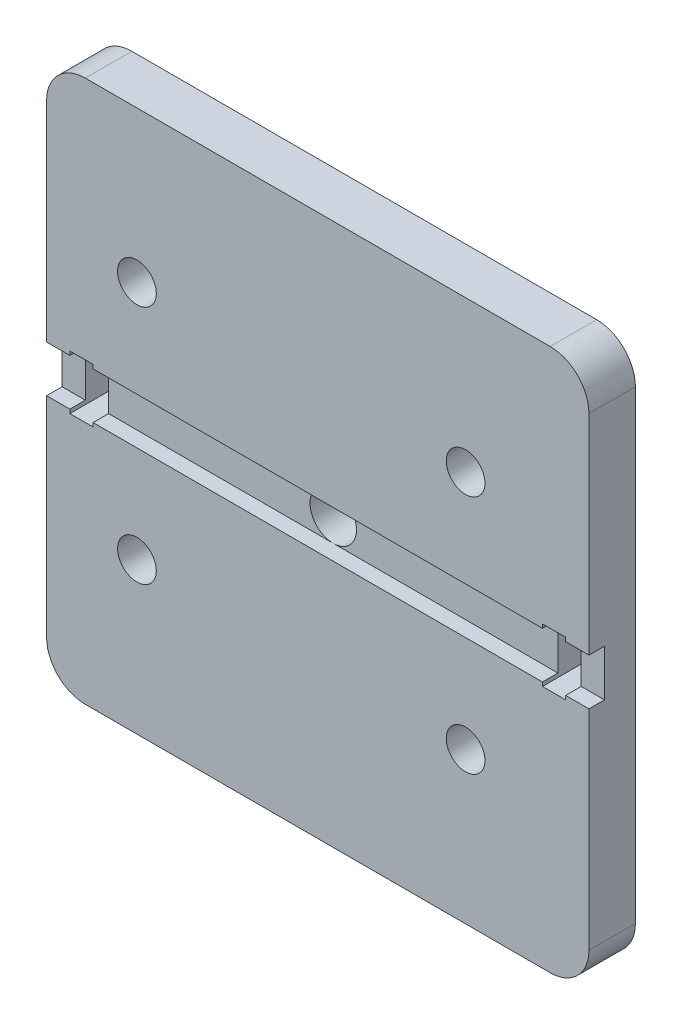
ISO-10303-21;
HEADER;
FILE_DESCRIPTION(('STEP AP214'),'2;1');
FILE_NAME('part.step','',(''),(''),'','','');
FILE_SCHEMA(('AUTOMOTIVE_DESIGN { 1 0 10303 214 1 1 1 1 }'));
ENDSEC;
DATA;
#1=APPLICATION_CONTEXT('core data for automotive mechanical design processes');
#2=APPLICATION_PROTOCOL_DEFINITION('international standard','automotive_design',2000,#1);
#3=PRODUCT_CONTEXT('',#1,'mechanical');
#4=PRODUCT('Part','Part','',(#3));
#5=PRODUCT_RELATED_PRODUCT_CATEGORY('part','',(#4));
#6=PRODUCT_DEFINITION_FORMATION('','',#4);
#7=PRODUCT_DEFINITION_CONTEXT('part definition',#1,'design');
#8=PRODUCT_DEFINITION('design','',#6,#7);
#9=PRODUCT_DEFINITION_SHAPE('','',#8);
#10=(LENGTH_UNIT() NAMED_UNIT(*) SI_UNIT(.MILLI.,.METRE.));
#11=(NAMED_UNIT(*) PLANE_ANGLE_UNIT() SI_UNIT($,.RADIAN.));
#12=(NAMED_UNIT(*) SI_UNIT($,.STERADIAN.) SOLID_ANGLE_UNIT());
#13=UNCERTAINTY_MEASURE_WITH_UNIT(LENGTH_MEASURE(1.E-05),#10,'distance_accuracy_value','');
#14=(GEOMETRIC_REPRESENTATION_CONTEXT(3) GLOBAL_UNCERTAINTY_ASSIGNED_CONTEXT((#13)) GLOBAL_UNIT_ASSIGNED_CONTEXT((#10,
#11,#12)) REPRESENTATION_CONTEXT('',''));
#15=CARTESIAN_POINT('',(0.,0.,0.));
#16=DIRECTION('',(0.,0.,1.));
#17=DIRECTION('',(1.,0.,0.));
#18=AXIS2_PLACEMENT_3D('',#15,#16,#17);
#19=CARTESIAN_POINT('',(0.,0.,4.));
#20=DIRECTION('',(0.,0.,1.));
#21=DIRECTION('',(1.,0.,0.));
#22=AXIS2_PLACEMENT_3D('',#19,#20,#21);
#23=PLANE('',#22);
#24=CARTESIAN_POINT('',(-16.4705882352942,389.117647058823,4.));
#25=DIRECTION('',(0.,0.,1.));
#26=DIRECTION('',(1.,0.,0.));
#27=AXIS2_PLACEMENT_3D('',#24,#25,#26);
#28=CIRCLE('',#27,3.);
#29=CARTESIAN_POINT('',(-16.4705882352942,392.117647058823,4.));
#30=VERTEX_POINT('',#29);
#31=CARTESIAN_POINT('',(-16.4705882352942,386.117647058823,4.));
#32=VERTEX_POINT('',#31);
#33=EDGE_CURVE('E58',#30,#32,#28,.T.);
#34=ORIENTED_EDGE('',*,*,#33,.F.);
#35=DIRECTION('',(-1.,0.,0.));
#36=VECTOR('',#35,1.);
#37=CARTESIAN_POINT('',(-51.4705882352942,392.117647058823,4.));
#38=LINE('',#37,#36);
#39=CARTESIAN_POINT('',(-45.4705882352942,392.117647058823,4.));
#40=VERTEX_POINT('',#39);
#41=EDGE_CURVE('E241',#30,#40,#38,.T.);
#42=ORIENTED_EDGE('',*,*,#41,.T.);
#43=DIRECTION('',(0.,-1.,0.));
#44=VECTOR('',#43,1.);
#45=CARTESIAN_POINT('',(-45.4705882352942,0.,4.));
#46=LINE('',#45,#44);
#47=CARTESIAN_POINT('',(-45.4705882352942,386.117647058823,4.));
#48=VERTEX_POINT('',#47);
#49=EDGE_CURVE('E344',#40,#48,#46,.T.);
#50=ORIENTED_EDGE('',*,*,#49,.T.);
#51=DIRECTION('',(1.,0.,0.));
#52=VECTOR('',#51,1.);
#53=CARTESIAN_POINT('',(-51.4705882352942,386.117647058823,4.));
#54=LINE('',#53,#52);
#55=EDGE_CURVE('E243',#48,#32,#54,.T.);
#56=ORIENTED_EDGE('',*,*,#55,.T.);
#57=EDGE_LOOP('',(#34,#42,#50,#56));
#58=FACE_BOUND('',#57,.T.);
#59=ADVANCED_FACE('F44',(#58),#23,.T.);
#60=CARTESIAN_POINT('',(0.,0.,6.));
#61=DIRECTION('',(0.,0.,1.));
#62=DIRECTION('',(1.,0.,0.));
#63=AXIS2_PLACEMENT_3D('',#60,#61,#62);
#64=PLANE('',#63);
#65=DIRECTION('',(-1.,0.,0.));
#66=VECTOR('',#65,1.);
#67=CARTESIAN_POINT('',(-51.4705882352942,392.117647058823,6.));
#68=LINE('',#67,#66);
#69=CARTESIAN_POINT('',(18.5294117647058,392.117647058823,6.));
#70=VERTEX_POINT('',#69);
#71=CARTESIAN_POINT('',(15.5294117647058,392.117647058823,6.));
#72=VERTEX_POINT('',#71);
#73=EDGE_CURVE('E288',#70,#72,#68,.T.);
#74=ORIENTED_EDGE('',*,*,#73,.F.);
#75=DIRECTION('',(0.,-1.,0.));
#76=VECTOR('',#75,1.);
#77=CARTESIAN_POINT('',(18.5294117647059,0.,6.));
#78=LINE('',#77,#76);
#79=CARTESIAN_POINT('',(18.5294117647058,419.117647058823,6.));
#80=VERTEX_POINT('',#79);
#81=EDGE_CURVE('E354',#80,#70,#78,.T.);
#82=ORIENTED_EDGE('',*,*,#81,.F.);
#83=CARTESIAN_POINT('',(13.5294117647058,419.117647058823,6.));
#84=DIRECTION('',(0.,0.,1.));
#85=DIRECTION('',(1.,0.,0.));
#86=AXIS2_PLACEMENT_3D('',#83,#84,#85);
#87=CIRCLE('',#86,5.);
#88=CARTESIAN_POINT('',(13.5294117647058,424.117647058823,6.));
#89=VERTEX_POINT('',#88);
#90=EDGE_CURVE('E358',#89,#80,#87,.F.);
#91=ORIENTED_EDGE('',*,*,#90,.F.);
#92=DIRECTION('',(-1.,0.,0.));
#93=VECTOR('',#92,1.);
#94=CARTESIAN_POINT('',(0.,424.117647058823,6.));
#95=LINE('',#94,#93);
#96=CARTESIAN_POINT('',(-46.4705882352941,424.117647058823,6.));
#97=VERTEX_POINT('',#96);
#98=EDGE_CURVE('E362',#89,#97,#95,.T.);
#99=ORIENTED_EDGE('',*,*,#98,.T.);
#100=CARTESIAN_POINT('',(-46.4705882352942,419.117647058823,6.));
#101=DIRECTION('',(0.,0.,1.));
#102=DIRECTION('',(1.,0.,0.));
#103=AXIS2_PLACEMENT_3D('',#100,#101,#102);
#104=CIRCLE('',#103,5.);
#105=CARTESIAN_POINT('',(-51.4705882352942,419.117647058823,6.));
#106=VERTEX_POINT('',#105);
#107=EDGE_CURVE('E365',#97,#106,#104,.T.);
#108=ORIENTED_EDGE('',*,*,#107,.T.);
#109=DIRECTION('',(0.,-1.,0.));
#110=VECTOR('',#109,1.);
#111=CARTESIAN_POINT('',(-51.4705882352941,0.,6.));
#112=LINE('',#111,#110);
#113=CARTESIAN_POINT('',(-51.4705882352942,392.117647058823,6.));
#114=VERTEX_POINT('',#113);
#115=EDGE_CURVE('E369',#106,#114,#112,.T.);
#116=ORIENTED_EDGE('',*,*,#115,.T.);
#117=DIRECTION('',(-1.,0.,0.));
#118=VECTOR('',#117,1.);
#119=CARTESIAN_POINT('',(0.,392.117647058823,6.));
#120=LINE('',#119,#118);
#121=CARTESIAN_POINT('',(-48.4705882352942,392.117647058823,6.));
#122=VERTEX_POINT('',#121);
#123=EDGE_CURVE('E565',#122,#114,#120,.T.);
#124=ORIENTED_EDGE('',*,*,#123,.F.);
#125=DIRECTION('',(0.,-1.,0.));
#126=VECTOR('',#125,1.);
#127=CARTESIAN_POINT('',(-48.4705882352945,0.,6.));
#128=LINE('',#127,#126);
#129=CARTESIAN_POINT('',(-48.4705882352942,392.617647058823,6.));
#130=VERTEX_POINT('',#129);
#131=EDGE_CURVE('E429',#130,#122,#128,.T.);
#132=ORIENTED_EDGE('',*,*,#131,.F.);
#133=DIRECTION('',(1.,0.,0.));
#134=VECTOR('',#133,1.);
#135=CARTESIAN_POINT('',(0.,392.617647058823,6.));
#136=LINE('',#135,#134);
#137=CARTESIAN_POINT('',(-45.4705882352942,392.617647058823,6.));
#138=VERTEX_POINT('',#137);
#139=EDGE_CURVE('E415',#130,#138,#136,.T.);
#140=ORIENTED_EDGE('',*,*,#139,.T.);
#141=DIRECTION('',(0.,-1.,0.));
#142=VECTOR('',#141,1.);
#143=CARTESIAN_POINT('',(-45.4705882352942,0.,6.));
#144=LINE('',#143,#142);
#145=CARTESIAN_POINT('',(-45.4705882352942,392.117647058823,6.));
#146=VERTEX_POINT('',#145);
#147=EDGE_CURVE('E420',#138,#146,#144,.T.);
#148=ORIENTED_EDGE('',*,*,#147,.T.);
#149=CARTESIAN_POINT('',(12.5294117647058,392.117647058823,6.));
#150=VERTEX_POINT('',#149);
#151=EDGE_CURVE('E567',#150,#146,#120,.T.);
#152=ORIENTED_EDGE('',*,*,#151,.F.);
#153=DIRECTION('',(0.,-1.,0.));
#154=VECTOR('',#153,1.);
#155=CARTESIAN_POINT('',(12.5294117647057,0.,6.));
#156=LINE('',#155,#154);
#157=CARTESIAN_POINT('',(12.5294117647058,392.617647058823,6.));
#158=VERTEX_POINT('',#157);
#159=EDGE_CURVE('E398',#158,#150,#156,.T.);
#160=ORIENTED_EDGE('',*,*,#159,.F.);
#161=DIRECTION('',(-1.,0.,0.));
#162=VECTOR('',#161,1.);
#163=CARTESIAN_POINT('',(0.,392.617647058823,6.));
#164=LINE('',#163,#162);
#165=CARTESIAN_POINT('',(15.5294117647058,392.617647058823,6.));
#166=VERTEX_POINT('',#165);
#167=EDGE_CURVE('E402',#166,#158,#164,.T.);
#168=ORIENTED_EDGE('',*,*,#167,.F.);
#169=DIRECTION('',(0.,-1.,0.));
#170=VECTOR('',#169,1.);
#171=CARTESIAN_POINT('',(15.5294117647058,0.,6.));
#172=LINE('',#171,#170);
#173=EDGE_CURVE('E407',#166,#72,#172,.T.);
#174=ORIENTED_EDGE('',*,*,#173,.T.);
#175=EDGE_LOOP('',(#74,#82,#91,#99,#108,#116,#124,#132,#140,#148,#152,#160,#168,#174));
#176=FACE_BOUND('',#175,.T.);
#177=CARTESIAN_POINT('',(2.61208369837496,404.617647058823,6.));
#178=DIRECTION('',(0.,0.,1.));
#179=DIRECTION('',(1.,0.,0.));
#180=AXIS2_PLACEMENT_3D('',#177,#178,#179);
#181=CIRCLE('',#180,2.5);
#182=CARTESIAN_POINT('',(5.11208369837496,404.617647058823,6.));
#183=VERTEX_POINT('',#182);
#184=EDGE_CURVE('E389',#183,#183,#181,.T.);
#185=ORIENTED_EDGE('',*,*,#184,.F.);
#186=EDGE_LOOP('',(#185));
#187=FACE_BOUND('',#186,.T.);
#188=CARTESIAN_POINT('',(-39.8105983240561,404.617647058823,6.));
#189=DIRECTION('',(0.,0.,1.));
#190=DIRECTION('',(1.,0.,0.));
#191=AXIS2_PLACEMENT_3D('',#188,#189,#190);
#192=CIRCLE('',#191,2.5);
#193=CARTESIAN_POINT('',(-37.3105983240561,404.617647058823,6.));
#194=VERTEX_POINT('',#193);
#195=EDGE_CURVE('E385',#194,#194,#192,.T.);
#196=ORIENTED_EDGE('',*,*,#195,.F.);
#197=EDGE_LOOP('',(#196));
#198=FACE_BOUND('',#197,.T.);
#199=ADVANCED_FACE('F579',(#176,#187,#198),#64,.T.);
#200=CARTESIAN_POINT('',(0.,392.617647058823,6.));
#201=DIRECTION('',(0.,1.,0.));
#202=DIRECTION('',(0.,0.,1.));
#203=AXIS2_PLACEMENT_3D('',#200,#201,#202);
#204=PLANE('',#203);
#205=DIRECTION('',(1.,0.,0.));
#206=VECTOR('',#205,1.);
#207=CARTESIAN_POINT('',(0.,392.617647058823,0.));
#208=LINE('',#207,#206);
#209=CARTESIAN_POINT('',(-48.4705882352942,392.617647058823,0.));
#210=VERTEX_POINT('',#209);
#211=CARTESIAN_POINT('',(-45.4705882352942,392.617647058823,0.));
#212=VERTEX_POINT('',#211);
#213=EDGE_CURVE('E495',#210,#212,#208,.T.);
#214=ORIENTED_EDGE('',*,*,#213,.T.);
#215=DIRECTION('',(0.,0.,-1.));
#216=VECTOR('',#215,1.);
#217=CARTESIAN_POINT('',(-45.4705882352942,392.617647058823,6.));
#218=LINE('',#217,#216);
#219=EDGE_CURVE('E520',#138,#212,#218,.T.);
#220=ORIENTED_EDGE('',*,*,#219,.F.);
#221=ORIENTED_EDGE('',*,*,#139,.F.);
#222=DIRECTION('',(0.,0.,-1.));
#223=VECTOR('',#222,1.);
#224=CARTESIAN_POINT('',(-48.4705882352942,392.617647058823,6.));
#225=LINE('',#224,#223);
#226=EDGE_CURVE('E510',#130,#210,#225,.T.);
#227=ORIENTED_EDGE('',*,*,#226,.T.);
#228=EDGE_LOOP('',(#214,#220,#221,#227));
#229=FACE_BOUND('',#228,.T.);
#230=ADVANCED_FACE('F586',(#229),#204,.F.);
#231=CARTESIAN_POINT('',(-45.4705882352942,0.,6.));
#232=DIRECTION('',(1.,0.,0.));
#233=DIRECTION('',(0.,0.,-1.));
#234=AXIS2_PLACEMENT_3D('',#231,#232,#233);
#235=PLANE('',#234);
#236=ORIENTED_EDGE('',*,*,#49,.F.);
#237=DIRECTION('',(0.,0.,1.));
#238=VECTOR('',#237,1.);
#239=CARTESIAN_POINT('',(-45.4705882352942,392.117647058823,6.));
#240=LINE('',#239,#238);
#241=EDGE_CURVE('E253',#40,#146,#240,.T.);
#242=ORIENTED_EDGE('',*,*,#241,.T.);
#243=ORIENTED_EDGE('',*,*,#147,.F.);
#244=ORIENTED_EDGE('',*,*,#219,.T.);
#245=DIRECTION('',(0.,-1.,0.));
#246=VECTOR('',#245,1.);
#247=CARTESIAN_POINT('',(-45.4705882352942,0.,0.));
#248=LINE('',#247,#246);
#249=CARTESIAN_POINT('',(-45.4705882352942,385.617647058823,0.));
#250=VERTEX_POINT('',#249);
#251=EDGE_CURVE('E499',#212,#250,#248,.T.);
#252=ORIENTED_EDGE('',*,*,#251,.T.);
#253=DIRECTION('',(0.,0.,-1.));
#254=VECTOR('',#253,1.);
#255=CARTESIAN_POINT('',(-45.4705882352942,385.617647058823,6.));
#256=LINE('',#255,#254);
#257=CARTESIAN_POINT('',(-45.4705882352942,385.617647058823,6.));
#258=VERTEX_POINT('',#257);
#259=EDGE_CURVE('E517',#258,#250,#256,.T.);
#260=ORIENTED_EDGE('',*,*,#259,.F.);
#261=CARTESIAN_POINT('',(-45.4705882352942,386.117647058823,6.));
#262=VERTEX_POINT('',#261);
#263=EDGE_CURVE('E419',#262,#258,#144,.T.);
#264=ORIENTED_EDGE('',*,*,#263,.F.);
#265=DIRECTION('',(0.,0.,-1.));
#266=VECTOR('',#265,1.);
#267=CARTESIAN_POINT('',(-45.4705882352942,386.117647058823,6.));
#268=LINE('',#267,#266);
#269=EDGE_CURVE('E66',#262,#48,#268,.T.);
#270=ORIENTED_EDGE('',*,*,#269,.T.);
#271=EDGE_LOOP('',(#236,#242,#243,#244,#252,#260,#264,#270));
#272=FACE_BOUND('',#271,.T.);
#273=ADVANCED_FACE('F577',(#272),#235,.F.);
#274=CARTESIAN_POINT('',(0.,385.617647058823,6.));
#275=DIRECTION('',(0.,1.,0.));
#276=DIRECTION('',(0.,0.,1.));
#277=AXIS2_PLACEMENT_3D('',#274,#275,#276);
#278=PLANE('',#277);
#279=DIRECTION('',(1.,0.,0.));
#280=VECTOR('',#279,1.);
#281=CARTESIAN_POINT('',(0.,385.617647058823,0.));
#282=LINE('',#281,#280);
#283=CARTESIAN_POINT('',(-48.4705882352942,385.617647058823,0.));
#284=VERTEX_POINT('',#283);
#285=EDGE_CURVE('E503',#284,#250,#282,.T.);
#286=ORIENTED_EDGE('',*,*,#285,.F.);
#287=DIRECTION('',(0.,0.,-1.));
#288=VECTOR('',#287,1.);
#289=CARTESIAN_POINT('',(-48.4705882352942,385.617647058823,6.));
#290=LINE('',#289,#288);
#291=CARTESIAN_POINT('',(-48.4705882352942,385.617647058823,6.));
#292=VERTEX_POINT('',#291);
#293=EDGE_CURVE('E513',#292,#284,#290,.T.);
#294=ORIENTED_EDGE('',*,*,#293,.F.);
#295=DIRECTION('',(1.,0.,0.));
#296=VECTOR('',#295,1.);
#297=CARTESIAN_POINT('',(0.,385.617647058823,6.));
#298=LINE('',#297,#296);
#299=EDGE_CURVE('E424',#292,#258,#298,.T.);
#300=ORIENTED_EDGE('',*,*,#299,.T.);
#301=ORIENTED_EDGE('',*,*,#259,.T.);
#302=EDGE_LOOP('',(#286,#294,#300,#301));
#303=FACE_BOUND('',#302,.T.);
#304=ADVANCED_FACE('F596',(#303),#278,.T.);
#305=CARTESIAN_POINT('',(12.5294117647057,0.,6.));
#306=DIRECTION('',(1.,0.,0.));
#307=DIRECTION('',(0.,1.,0.));
#308=AXIS2_PLACEMENT_3D('',#305,#306,#307);
#309=PLANE('',#308);
#310=DIRECTION('',(0.,0.,1.));
#311=VECTOR('',#310,1.);
#312=CARTESIAN_POINT('',(12.5294117647058,392.117647058823,6.));
#313=LINE('',#312,#311);
#314=CARTESIAN_POINT('',(12.5294117647058,392.117647058823,4.));
#315=VERTEX_POINT('',#314);
#316=EDGE_CURVE('E334',#315,#150,#313,.T.);
#317=ORIENTED_EDGE('',*,*,#316,.F.);
#318=DIRECTION('',(0.,-1.,0.));
#319=VECTOR('',#318,1.);
#320=CARTESIAN_POINT('',(12.5294117647057,0.,4.));
#321=LINE('',#320,#319);
#322=CARTESIAN_POINT('',(12.5294117647058,386.117647058823,4.));
#323=VERTEX_POINT('',#322);
#324=EDGE_CURVE('E261',#315,#323,#321,.T.);
#325=ORIENTED_EDGE('',*,*,#324,.T.);
#326=DIRECTION('',(0.,0.,-1.));
#327=VECTOR('',#326,1.);
#328=CARTESIAN_POINT('',(12.5294117647058,386.117647058823,6.));
#329=LINE('',#328,#327);
#330=CARTESIAN_POINT('',(12.5294117647058,386.117647058823,6.));
#331=VERTEX_POINT('',#330);
#332=EDGE_CURVE('E321',#331,#323,#329,.T.);
#333=ORIENTED_EDGE('',*,*,#332,.F.);
#334=CARTESIAN_POINT('',(12.5294117647058,385.617647058823,6.));
#335=VERTEX_POINT('',#334);
#336=EDGE_CURVE('E397',#331,#335,#156,.T.);
#337=ORIENTED_EDGE('',*,*,#336,.T.);
#338=DIRECTION('',(0.,0.,-1.));
#339=VECTOR('',#338,1.);
#340=CARTESIAN_POINT('',(12.5294117647058,385.617647058823,6.));
#341=LINE('',#340,#339);
#342=CARTESIAN_POINT('',(12.5294117647058,385.617647058823,0.));
#343=VERTEX_POINT('',#342);
#344=EDGE_CURVE('E525',#335,#343,#341,.T.);
#345=ORIENTED_EDGE('',*,*,#344,.T.);
#346=DIRECTION('',(0.,-1.,0.));
#347=VECTOR('',#346,1.);
#348=CARTESIAN_POINT('',(12.5294117647057,0.,0.));
#349=LINE('',#348,#347);
#350=CARTESIAN_POINT('',(12.5294117647058,392.617647058823,0.));
#351=VERTEX_POINT('',#350);
#352=EDGE_CURVE('E479',#351,#343,#349,.T.);
#353=ORIENTED_EDGE('',*,*,#352,.F.);
#354=DIRECTION('',(0.,0.,-1.));
#355=VECTOR('',#354,1.);
#356=CARTESIAN_POINT('',(12.5294117647058,392.617647058823,6.));
#357=LINE('',#356,#355);
#358=EDGE_CURVE('E514',#158,#351,#357,.T.);
#359=ORIENTED_EDGE('',*,*,#358,.F.);
#360=ORIENTED_EDGE('',*,*,#159,.T.);
#361=EDGE_LOOP('',(#317,#325,#333,#337,#345,#353,#359,#360));
#362=FACE_BOUND('',#361,.T.);
#363=ADVANCED_FACE('F656',(#362),#309,.T.);
#364=CARTESIAN_POINT('',(0.,392.617647058823,6.));
#365=DIRECTION('',(0.,-1.,0.));
#366=DIRECTION('',(0.,0.,-1.));
#367=AXIS2_PLACEMENT_3D('',#364,#365,#366);
#368=PLANE('',#367);
#369=DIRECTION('',(-1.,0.,0.));
#370=VECTOR('',#369,1.);
#371=CARTESIAN_POINT('',(0.,392.617647058823,0.));
#372=LINE('',#371,#370);
#373=CARTESIAN_POINT('',(15.5294117647058,392.617647058823,0.));
#374=VERTEX_POINT('',#373);
#375=EDGE_CURVE('E483',#374,#351,#372,.T.);
#376=ORIENTED_EDGE('',*,*,#375,.F.);
#377=DIRECTION('',(0.,0.,-1.));
#378=VECTOR('',#377,1.);
#379=CARTESIAN_POINT('',(15.5294117647058,392.617647058823,6.));
#380=LINE('',#379,#378);
#381=EDGE_CURVE('E533',#166,#374,#380,.T.);
#382=ORIENTED_EDGE('',*,*,#381,.F.);
#383=ORIENTED_EDGE('',*,*,#167,.T.);
#384=ORIENTED_EDGE('',*,*,#358,.T.);
#385=EDGE_LOOP('',(#376,#382,#383,#384));
#386=FACE_BOUND('',#385,.T.);
#387=ADVANCED_FACE('F668',(#386),#368,.T.);
#388=CARTESIAN_POINT('',(15.5294117647058,0.,6.));
#389=DIRECTION('',(1.,0.,0.));
#390=DIRECTION('',(0.,0.,-1.));
#391=AXIS2_PLACEMENT_3D('',#388,#389,#390);
#392=PLANE('',#391);
#393=DIRECTION('',(0.,-1.,0.));
#394=VECTOR('',#393,1.);
#395=CARTESIAN_POINT('',(15.5294117647058,0.,4.));
#396=LINE('',#395,#394);
#397=CARTESIAN_POINT('',(15.5294117647058,392.117647058823,4.));
#398=VERTEX_POINT('',#397);
#399=CARTESIAN_POINT('',(15.5294117647058,386.117647058823,4.));
#400=VERTEX_POINT('',#399);
#401=EDGE_CURVE('E339',#398,#400,#396,.T.);
#402=ORIENTED_EDGE('',*,*,#401,.F.);
#403=DIRECTION('',(0.,0.,1.));
#404=VECTOR('',#403,1.);
#405=CARTESIAN_POINT('',(15.5294117647058,392.117647058823,6.));
#406=LINE('',#405,#404);
#407=EDGE_CURVE('E330',#398,#72,#406,.T.);
#408=ORIENTED_EDGE('',*,*,#407,.T.);
#409=ORIENTED_EDGE('',*,*,#173,.F.);
#410=ORIENTED_EDGE('',*,*,#381,.T.);
#411=DIRECTION('',(0.,-1.,0.));
#412=VECTOR('',#411,1.);
#413=CARTESIAN_POINT('',(15.5294117647058,0.,0.));
#414=LINE('',#413,#412);
#415=CARTESIAN_POINT('',(15.5294117647058,385.617647058823,0.));
#416=VERTEX_POINT('',#415);
#417=EDGE_CURVE('E487',#374,#416,#414,.T.);
#418=ORIENTED_EDGE('',*,*,#417,.T.);
#419=DIRECTION('',(0.,0.,-1.));
#420=VECTOR('',#419,1.);
#421=CARTESIAN_POINT('',(15.5294117647058,385.617647058823,6.));
#422=LINE('',#421,#420);
#423=CARTESIAN_POINT('',(15.5294117647058,385.617647058823,6.));
#424=VERTEX_POINT('',#423);
#425=EDGE_CURVE('E528',#424,#416,#422,.T.);
#426=ORIENTED_EDGE('',*,*,#425,.F.);
#427=CARTESIAN_POINT('',(15.5294117647058,386.117647058823,6.));
#428=VERTEX_POINT('',#427);
#429=EDGE_CURVE('E406',#428,#424,#172,.T.);
#430=ORIENTED_EDGE('',*,*,#429,.F.);
#431=DIRECTION('',(0.,0.,-1.));
#432=VECTOR('',#431,1.);
#433=CARTESIAN_POINT('',(15.5294117647058,386.117647058823,6.));
#434=LINE('',#433,#432);
#435=EDGE_CURVE('E317',#428,#400,#434,.T.);
#436=ORIENTED_EDGE('',*,*,#435,.T.);
#437=EDGE_LOOP('',(#402,#408,#409,#410,#418,#426,#430,#436));
#438=FACE_BOUND('',#437,.T.);
#439=ADVANCED_FACE('F673',(#438),#392,.F.);
#440=CARTESIAN_POINT('',(13.5294117647058,359.117647058823,6.));
#441=DIRECTION('',(0.,0.,-1.));
#442=DIRECTION('',(-1.,0.,0.));
#443=AXIS2_PLACEMENT_3D('',#440,#441,#442);
#444=CYLINDRICAL_SURFACE('',#443,5.);
#445=CARTESIAN_POINT('',(13.5294117647058,359.117647058823,0.));
#446=DIRECTION('',(0.,0.,1.));
#447=DIRECTION('',(1.,0.,0.));
#448=AXIS2_PLACEMENT_3D('',#445,#446,#447);
#449=CIRCLE('',#448,5.);
#450=CARTESIAN_POINT('',(18.5294117647058,359.117647058823,0.));
#451=VERTEX_POINT('',#450);
#452=CARTESIAN_POINT('',(13.5294117647058,354.117647058823,0.));
#453=VERTEX_POINT('',#452);
#454=EDGE_CURVE('E347',#451,#453,#449,.F.);
#455=ORIENTED_EDGE('',*,*,#454,.F.);
#456=DIRECTION('',(0.,0.,-1.));
#457=VECTOR('',#456,1.);
#458=CARTESIAN_POINT('',(18.5294117647058,359.117647058823,6.));
#459=LINE('',#458,#457);
#460=CARTESIAN_POINT('',(18.5294117647058,359.117647058823,6.));
#461=VERTEX_POINT('',#460);
#462=EDGE_CURVE('E529',#461,#451,#459,.T.);
#463=ORIENTED_EDGE('',*,*,#462,.F.);
#464=CARTESIAN_POINT('',(13.5294117647058,359.117647058823,6.));
#465=DIRECTION('',(0.,0.,1.));
#466=DIRECTION('',(1.,0.,0.));
#467=AXIS2_PLACEMENT_3D('',#464,#465,#466);
#468=CIRCLE('',#467,5.);
#469=CARTESIAN_POINT('',(13.5294117647058,354.117647058823,6.));
#470=VERTEX_POINT('',#469);
#471=EDGE_CURVE('E348',#461,#470,#468,.F.);
#472=ORIENTED_EDGE('',*,*,#471,.T.);
#473=DIRECTION('',(0.,0.,-1.));
#474=VECTOR('',#473,1.);
#475=CARTESIAN_POINT('',(13.5294117647058,354.117647058823,6.));
#476=LINE('',#475,#474);
#477=EDGE_CURVE('E433',#470,#453,#476,.T.);
#478=ORIENTED_EDGE('',*,*,#477,.T.);
#479=EDGE_LOOP('',(#455,#463,#472,#478));
#480=FACE_BOUND('',#479,.T.);
#481=ADVANCED_FACE('F46',(#480),#444,.T.);
#482=CARTESIAN_POINT('',(18.5294117647059,0.,6.));
#483=DIRECTION('',(1.,0.,0.));
#484=DIRECTION('',(0.,1.,0.));
#485=AXIS2_PLACEMENT_3D('',#482,#483,#484);
#486=PLANE('',#485);
#487=DIRECTION('',(0.,0.,1.));
#488=VECTOR('',#487,1.);
#489=CARTESIAN_POINT('',(18.5294117647058,392.117647058823,4.));
#490=LINE('',#489,#488);
#491=CARTESIAN_POINT('',(18.5294117647058,392.117647058823,4.));
#492=VERTEX_POINT('',#491);
#493=EDGE_CURVE('E306',#492,#70,#490,.T.);
#494=ORIENTED_EDGE('',*,*,#493,.F.);
#495=DIRECTION('',(0.,1.,0.));
#496=VECTOR('',#495,1.);
#497=CARTESIAN_POINT('',(18.5294117647058,392.117647058823,4.));
#498=LINE('',#497,#496);
#499=CARTESIAN_POINT('',(18.5294117647058,386.117647058823,4.));
#500=VERTEX_POINT('',#499);
#501=EDGE_CURVE('E269',#500,#492,#498,.T.);
#502=ORIENTED_EDGE('',*,*,#501,.F.);
#503=DIRECTION('',(0.,0.,1.));
#504=VECTOR('',#503,1.);
#505=CARTESIAN_POINT('',(18.5294117647058,386.117647058823,4.));
#506=LINE('',#505,#504);
#507=CARTESIAN_POINT('',(18.5294117647058,386.117647058823,6.));
#508=VERTEX_POINT('',#507);
#509=EDGE_CURVE('E309',#500,#508,#506,.T.);
#510=ORIENTED_EDGE('',*,*,#509,.T.);
#511=EDGE_CURVE('E352',#508,#461,#78,.T.);
#512=ORIENTED_EDGE('',*,*,#511,.T.);
#513=ORIENTED_EDGE('',*,*,#462,.T.);
#514=DIRECTION('',(0.,-1.,0.));
#515=VECTOR('',#514,1.);
#516=CARTESIAN_POINT('',(18.5294117647059,0.,0.));
#517=LINE('',#516,#515);
#518=CARTESIAN_POINT('',(18.5294117647058,419.117647058823,0.));
#519=VERTEX_POINT('',#518);
#520=EDGE_CURVE('E437',#519,#451,#517,.T.);
#521=ORIENTED_EDGE('',*,*,#520,.F.);
#522=DIRECTION('',(0.,0.,-1.));
#523=VECTOR('',#522,1.);
#524=CARTESIAN_POINT('',(18.5294117647058,419.117647058823,6.));
#525=LINE('',#524,#523);
#526=EDGE_CURVE('E557',#80,#519,#525,.T.);
#527=ORIENTED_EDGE('',*,*,#526,.F.);
#528=ORIENTED_EDGE('',*,*,#81,.T.);
#529=EDGE_LOOP('',(#494,#502,#510,#512,#513,#521,#527,#528));
#530=FACE_BOUND('',#529,.T.);
#531=ADVANCED_FACE('F612',(#530),#486,.T.);
#532=CARTESIAN_POINT('',(13.5294117647058,419.117647058823,6.));
#533=DIRECTION('',(0.,0.,-1.));
#534=DIRECTION('',(-1.,0.,0.));
#535=AXIS2_PLACEMENT_3D('',#532,#533,#534);
#536=CYLINDRICAL_SURFACE('',#535,5.);
#537=CARTESIAN_POINT('',(13.5294117647058,419.117647058823,0.));
#538=DIRECTION('',(0.,0.,1.));
#539=DIRECTION('',(1.,0.,0.));
#540=AXIS2_PLACEMENT_3D('',#537,#538,#539);
#541=CIRCLE('',#540,5.);
#542=CARTESIAN_POINT('',(13.5294117647058,424.117647058823,0.));
#543=VERTEX_POINT('',#542);
#544=EDGE_CURVE('E441',#543,#519,#541,.F.);
#545=ORIENTED_EDGE('',*,*,#544,.F.);
#546=DIRECTION('',(0.,0.,-1.));
#547=VECTOR('',#546,1.);
#548=CARTESIAN_POINT('',(13.5294117647058,424.117647058823,6.));
#549=LINE('',#548,#547);
#550=EDGE_CURVE('E554',#89,#543,#549,.T.);
#551=ORIENTED_EDGE('',*,*,#550,.F.);
#552=ORIENTED_EDGE('',*,*,#90,.T.);
#553=ORIENTED_EDGE('',*,*,#526,.T.);
#554=EDGE_LOOP('',(#545,#551,#552,#553));
#555=FACE_BOUND('',#554,.T.);
#556=ADVANCED_FACE('F632',(#555),#536,.T.);
#557=CARTESIAN_POINT('',(0.,424.117647058823,6.));
#558=DIRECTION('',(0.,-1.,0.));
#559=DIRECTION('',(0.,0.,-1.));
#560=AXIS2_PLACEMENT_3D('',#557,#558,#559);
#561=PLANE('',#560);
#562=DIRECTION('',(-1.,0.,0.));
#563=VECTOR('',#562,1.);
#564=CARTESIAN_POINT('',(0.,424.117647058823,0.));
#565=LINE('',#564,#563);
#566=CARTESIAN_POINT('',(-46.4705882352941,424.117647058823,0.));
#567=VERTEX_POINT('',#566);
#568=EDGE_CURVE('E445',#543,#567,#565,.T.);
#569=ORIENTED_EDGE('',*,*,#568,.T.);
#570=DIRECTION('',(0.,0.,-1.));
#571=VECTOR('',#570,1.);
#572=CARTESIAN_POINT('',(-46.4705882352941,424.117647058823,6.));
#573=LINE('',#572,#571);
#574=EDGE_CURVE('E550',#97,#567,#573,.T.);
#575=ORIENTED_EDGE('',*,*,#574,.F.);
#576=ORIENTED_EDGE('',*,*,#98,.F.);
#577=ORIENTED_EDGE('',*,*,#550,.T.);
#578=EDGE_LOOP('',(#569,#575,#576,#577));
#579=FACE_BOUND('',#578,.T.);
#580=ADVANCED_FACE('F636',(#579),#561,.F.);
#581=CARTESIAN_POINT('',(-46.4705882352942,419.117647058823,6.));
#582=DIRECTION('',(0.,0.,-1.));
#583=DIRECTION('',(-1.,0.,0.));
#584=AXIS2_PLACEMENT_3D('',#581,#582,#583);
#585=CYLINDRICAL_SURFACE('',#584,5.);
#586=CARTESIAN_POINT('',(-46.4705882352942,419.117647058823,0.));
#587=DIRECTION('',(0.,0.,1.));
#588=DIRECTION('',(1.,0.,0.));
#589=AXIS2_PLACEMENT_3D('',#586,#587,#588);
#590=CIRCLE('',#589,5.);
#591=CARTESIAN_POINT('',(-51.4705882352942,419.117647058823,0.));
#592=VERTEX_POINT('',#591);
#593=EDGE_CURVE('E448',#567,#592,#590,.T.);
#594=ORIENTED_EDGE('',*,*,#593,.T.);
#595=DIRECTION('',(0.,0.,-1.));
#596=VECTOR('',#595,1.);
#597=CARTESIAN_POINT('',(-51.4705882352942,419.117647058823,6.));
#598=LINE('',#597,#596);
#599=EDGE_CURVE('E546',#106,#592,#598,.T.);
#600=ORIENTED_EDGE('',*,*,#599,.F.);
#601=ORIENTED_EDGE('',*,*,#107,.F.);
#602=ORIENTED_EDGE('',*,*,#574,.T.);
#603=EDGE_LOOP('',(#594,#600,#601,#602));
#604=FACE_BOUND('',#603,.T.);
#605=ADVANCED_FACE('F641',(#604),#585,.T.);
#606=CARTESIAN_POINT('',(-51.4705882352941,0.,6.));
#607=DIRECTION('',(1.,0.,0.));
#608=DIRECTION('',(0.,1.,0.));
#609=AXIS2_PLACEMENT_3D('',#606,#607,#608);
#610=PLANE('',#609);
#611=DIRECTION('',(0.,-1.,0.));
#612=VECTOR('',#611,1.);
#613=CARTESIAN_POINT('',(-51.4705882352942,392.117647058823,4.));
#614=LINE('',#613,#612);
#615=CARTESIAN_POINT('',(-51.4705882352942,392.117647058823,4.));
#616=VERTEX_POINT('',#615);
#617=CARTESIAN_POINT('',(-51.4705882352942,386.117647058823,4.));
#618=VERTEX_POINT('',#617);
#619=EDGE_CURVE('E284',#616,#618,#614,.T.);
#620=ORIENTED_EDGE('',*,*,#619,.F.);
#621=DIRECTION('',(0.,0.,1.));
#622=VECTOR('',#621,1.);
#623=CARTESIAN_POINT('',(-51.4705882352942,392.117647058823,4.));
#624=LINE('',#623,#622);
#625=EDGE_CURVE('E301',#616,#114,#624,.T.);
#626=ORIENTED_EDGE('',*,*,#625,.T.);
#627=ORIENTED_EDGE('',*,*,#115,.F.);
#628=ORIENTED_EDGE('',*,*,#599,.T.);
#629=DIRECTION('',(0.,-1.,0.));
#630=VECTOR('',#629,1.);
#631=CARTESIAN_POINT('',(-51.4705882352941,0.,0.));
#632=LINE('',#631,#630);
#633=CARTESIAN_POINT('',(-51.4705882352942,359.117647058823,0.));
#634=VERTEX_POINT('',#633);
#635=EDGE_CURVE('E451',#592,#634,#632,.T.);
#636=ORIENTED_EDGE('',*,*,#635,.T.);
#637=DIRECTION('',(0.,0.,-1.));
#638=VECTOR('',#637,1.);
#639=CARTESIAN_POINT('',(-51.4705882352942,359.117647058823,6.));
#640=LINE('',#639,#638);
#641=CARTESIAN_POINT('',(-51.4705882352942,359.117647058823,6.));
#642=VERTEX_POINT('',#641);
#643=EDGE_CURVE('E543',#642,#634,#640,.T.);
#644=ORIENTED_EDGE('',*,*,#643,.F.);
#645=CARTESIAN_POINT('',(-51.4705882352942,386.117647058823,6.));
#646=VERTEX_POINT('',#645);
#647=EDGE_CURVE('E368',#646,#642,#112,.T.);
#648=ORIENTED_EDGE('',*,*,#647,.F.);
#649=DIRECTION('',(0.,0.,1.));
#650=VECTOR('',#649,1.);
#651=CARTESIAN_POINT('',(-51.4705882352942,386.117647058823,4.));
#652=LINE('',#651,#650);
#653=EDGE_CURVE('E265',#618,#646,#652,.T.);
#654=ORIENTED_EDGE('',*,*,#653,.F.);
#655=EDGE_LOOP('',(#620,#626,#627,#628,#636,#644,#648,#654));
#656=FACE_BOUND('',#655,.T.);
#657=ADVANCED_FACE('F646',(#656),#610,.F.);
#658=CARTESIAN_POINT('',(-46.4705882352942,359.117647058823,6.));
#659=DIRECTION('',(0.,0.,-1.));
#660=DIRECTION('',(-1.,0.,0.));
#661=AXIS2_PLACEMENT_3D('',#658,#659,#660);
#662=CYLINDRICAL_SURFACE('',#661,5.);
#663=CARTESIAN_POINT('',(-46.4705882352942,359.117647058823,0.));
#664=DIRECTION('',(0.,0.,1.));
#665=DIRECTION('',(1.,0.,0.));
#666=AXIS2_PLACEMENT_3D('',#663,#664,#665);
#667=CIRCLE('',#666,5.);
#668=CARTESIAN_POINT('',(-46.4705882352941,354.117647058823,0.));
#669=VERTEX_POINT('',#668);
#670=EDGE_CURVE('E455',#669,#634,#667,.F.);
#671=ORIENTED_EDGE('',*,*,#670,.F.);
#672=DIRECTION('',(0.,0.,-1.));
#673=VECTOR('',#672,1.);
#674=CARTESIAN_POINT('',(-46.4705882352941,354.117647058823,6.));
#675=LINE('',#674,#673);
#676=CARTESIAN_POINT('',(-46.4705882352941,354.117647058823,6.));
#677=VERTEX_POINT('',#676);
#678=EDGE_CURVE('E540',#677,#669,#675,.T.);
#679=ORIENTED_EDGE('',*,*,#678,.F.);
#680=CARTESIAN_POINT('',(-46.4705882352942,359.117647058823,6.));
#681=DIRECTION('',(0.,0.,1.));
#682=DIRECTION('',(1.,0.,0.));
#683=AXIS2_PLACEMENT_3D('',#680,#681,#682);
#684=CIRCLE('',#683,5.);
#685=EDGE_CURVE('E373',#677,#642,#684,.F.);
#686=ORIENTED_EDGE('',*,*,#685,.T.);
#687=ORIENTED_EDGE('',*,*,#643,.T.);
#688=EDGE_LOOP('',(#671,#679,#686,#687));
#689=FACE_BOUND('',#688,.T.);
#690=ADVANCED_FACE('F875',(#689),#662,.T.);
#691=CARTESIAN_POINT('',(0.,385.617647058823,6.));
#692=DIRECTION('',(0.,-1.,0.));
#693=DIRECTION('',(0.,0.,-1.));
#694=AXIS2_PLACEMENT_3D('',#691,#692,#693);
#695=PLANE('',#694);
#696=DIRECTION('',(-1.,0.,0.));
#697=VECTOR('',#696,1.);
#698=CARTESIAN_POINT('',(0.,385.617647058823,0.));
#699=LINE('',#698,#697);
#700=EDGE_CURVE('E491',#416,#343,#699,.T.);
#701=ORIENTED_EDGE('',*,*,#700,.T.);
#702=ORIENTED_EDGE('',*,*,#344,.F.);
#703=DIRECTION('',(-1.,0.,0.));
#704=VECTOR('',#703,1.);
#705=CARTESIAN_POINT('',(0.,385.617647058823,6.));
#706=LINE('',#705,#704);
#707=EDGE_CURVE('E411',#424,#335,#706,.T.);
#708=ORIENTED_EDGE('',*,*,#707,.F.);
#709=ORIENTED_EDGE('',*,*,#425,.T.);
#710=EDGE_LOOP('',(#701,#702,#708,#709));
#711=FACE_BOUND('',#710,.T.);
#712=ADVANCED_FACE('F662',(#711),#695,.F.);
#713=CARTESIAN_POINT('',(2.61208369837496,373.617647058823,6.));
#714=DIRECTION('',(0.,0.,-1.));
#715=DIRECTION('',(-1.,0.,0.));
#716=AXIS2_PLACEMENT_3D('',#713,#714,#715);
#717=CYLINDRICAL_SURFACE('',#716,2.5);
#718=CARTESIAN_POINT('',(2.61208369837496,373.617647058823,6.));
#719=DIRECTION('',(0.,0.,1.));
#720=DIRECTION('',(1.,0.,0.));
#721=AXIS2_PLACEMENT_3D('',#718,#719,#720);
#722=CIRCLE('',#721,2.5);
#723=CARTESIAN_POINT('',(5.11208369837496,373.617647058823,6.));
#724=VERTEX_POINT('',#723);
#725=EDGE_CURVE('E393',#724,#724,#722,.T.);
#726=ORIENTED_EDGE('',*,*,#725,.T.);
#727=EDGE_LOOP('',(#726));
#728=FACE_BOUND('',#727,.T.);
#729=CARTESIAN_POINT('',(2.61208369837496,373.617647058823,0.));
#730=DIRECTION('',(0.,0.,1.));
#731=DIRECTION('',(1.,0.,0.));
#732=AXIS2_PLACEMENT_3D('',#729,#730,#731);
#733=CIRCLE('',#732,2.5);
#734=CARTESIAN_POINT('',(5.11208369837496,373.617647058823,0.));
#735=VERTEX_POINT('',#734);
#736=EDGE_CURVE('E475',#735,#735,#733,.T.);
#737=ORIENTED_EDGE('',*,*,#736,.F.);
#738=EDGE_LOOP('',(#737));
#739=FACE_BOUND('',#738,.T.);
#740=ADVANCED_FACE('F856',(#728,#739),#717,.F.);
#741=CARTESIAN_POINT('',(2.61208369837496,404.617647058823,6.));
#742=DIRECTION('',(0.,0.,-1.));
#743=DIRECTION('',(-1.,0.,0.));
#744=AXIS2_PLACEMENT_3D('',#741,#742,#743);
#745=CYLINDRICAL_SURFACE('',#744,2.5);
#746=ORIENTED_EDGE('',*,*,#184,.T.);
#747=EDGE_LOOP('',(#746));
#748=FACE_BOUND('',#747,.T.);
#749=CARTESIAN_POINT('',(2.61208369837496,404.617647058823,0.));
#750=DIRECTION('',(0.,0.,1.));
#751=DIRECTION('',(1.,0.,0.));
#752=AXIS2_PLACEMENT_3D('',#749,#750,#751);
#753=CIRCLE('',#752,2.5);
#754=CARTESIAN_POINT('',(5.11208369837496,404.617647058823,0.));
#755=VERTEX_POINT('',#754);
#756=EDGE_CURVE('E471',#755,#755,#753,.T.);
#757=ORIENTED_EDGE('',*,*,#756,.F.);
#758=EDGE_LOOP('',(#757));
#759=FACE_BOUND('',#758,.T.);
#760=ADVANCED_FACE('F846',(#748,#759),#745,.F.);
#761=CARTESIAN_POINT('',(-39.8105983240561,404.617647058823,6.));
#762=DIRECTION('',(0.,0.,-1.));
#763=DIRECTION('',(-1.,0.,0.));
#764=AXIS2_PLACEMENT_3D('',#761,#762,#763);
#765=CYLINDRICAL_SURFACE('',#764,2.5);
#766=ORIENTED_EDGE('',*,*,#195,.T.);
#767=EDGE_LOOP('',(#766));
#768=FACE_BOUND('',#767,.T.);
#769=CARTESIAN_POINT('',(-39.8105983240561,404.617647058823,0.));
#770=DIRECTION('',(0.,0.,1.));
#771=DIRECTION('',(1.,0.,0.));
#772=AXIS2_PLACEMENT_3D('',#769,#770,#771);
#773=CIRCLE('',#772,2.5);
#774=CARTESIAN_POINT('',(-37.3105983240561,404.617647058823,0.));
#775=VERTEX_POINT('',#774);
#776=EDGE_CURVE('E467',#775,#775,#773,.T.);
#777=ORIENTED_EDGE('',*,*,#776,.F.);
#778=EDGE_LOOP('',(#777));
#779=FACE_BOUND('',#778,.T.);
#780=ADVANCED_FACE('F836',(#768,#779),#765,.F.);
#781=CARTESIAN_POINT('',(-39.8105983240561,373.617647058823,6.));
#782=DIRECTION('',(0.,0.,-1.));
#783=DIRECTION('',(-1.,0.,0.));
#784=AXIS2_PLACEMENT_3D('',#781,#782,#783);
#785=CYLINDRICAL_SURFACE('',#784,2.5);
#786=CARTESIAN_POINT('',(-39.8105983240561,373.617647058823,6.));
#787=DIRECTION('',(0.,0.,1.));
#788=DIRECTION('',(1.,0.,0.));
#789=AXIS2_PLACEMENT_3D('',#786,#787,#788);
#790=CIRCLE('',#789,2.5);
#791=CARTESIAN_POINT('',(-37.3105983240561,373.617647058823,6.));
#792=VERTEX_POINT('',#791);
#793=EDGE_CURVE('E381',#792,#792,#790,.T.);
#794=ORIENTED_EDGE('',*,*,#793,.T.);
#795=EDGE_LOOP('',(#794));
#796=FACE_BOUND('',#795,.T.);
#797=CARTESIAN_POINT('',(-39.8105983240561,373.617647058823,0.));
#798=DIRECTION('',(0.,0.,1.));
#799=DIRECTION('',(1.,0.,0.));
#800=AXIS2_PLACEMENT_3D('',#797,#798,#799);
#801=CIRCLE('',#800,2.5);
#802=CARTESIAN_POINT('',(-37.3105983240561,373.617647058823,0.));
#803=VERTEX_POINT('',#802);
#804=EDGE_CURVE('E463',#803,#803,#801,.T.);
#805=ORIENTED_EDGE('',*,*,#804,.F.);
#806=EDGE_LOOP('',(#805));
#807=FACE_BOUND('',#806,.T.);
#808=ADVANCED_FACE('F828',(#796,#807),#785,.F.);
#809=CARTESIAN_POINT('',(0.,354.117647058823,6.));
#810=DIRECTION('',(0.,-1.,0.));
#811=DIRECTION('',(0.,0.,-1.));
#812=AXIS2_PLACEMENT_3D('',#809,#810,#811);
#813=PLANE('',#812);
#814=DIRECTION('',(-1.,0.,0.));
#815=VECTOR('',#814,1.);
#816=CARTESIAN_POINT('',(0.,354.117647058823,0.));
#817=LINE('',#816,#815);
#818=EDGE_CURVE('E459',#453,#669,#817,.T.);
#819=ORIENTED_EDGE('',*,*,#818,.F.);
#820=ORIENTED_EDGE('',*,*,#477,.F.);
#821=DIRECTION('',(-1.,0.,0.));
#822=VECTOR('',#821,1.);
#823=CARTESIAN_POINT('',(0.,354.117647058823,6.));
#824=LINE('',#823,#822);
#825=EDGE_CURVE('E377',#470,#677,#824,.T.);
#826=ORIENTED_EDGE('',*,*,#825,.T.);
#827=ORIENTED_EDGE('',*,*,#678,.T.);
#828=EDGE_LOOP('',(#819,#820,#826,#827));
#829=FACE_BOUND('',#828,.T.);
#830=ADVANCED_FACE('F623',(#829),#813,.T.);
#831=CARTESIAN_POINT('',(-48.4705882352945,0.,6.));
#832=DIRECTION('',(1.,0.,0.));
#833=DIRECTION('',(0.,1.,0.));
#834=AXIS2_PLACEMENT_3D('',#831,#832,#833);
#835=PLANE('',#834);
#836=DIRECTION('',(0.,0.,1.));
#837=VECTOR('',#836,1.);
#838=CARTESIAN_POINT('',(-48.4705882352942,392.117647058823,6.));
#839=LINE('',#838,#837);
#840=CARTESIAN_POINT('',(-48.4705882352942,392.117647058823,4.));
#841=VERTEX_POINT('',#840);
#842=EDGE_CURVE('E327',#841,#122,#839,.T.);
#843=ORIENTED_EDGE('',*,*,#842,.F.);
#844=DIRECTION('',(0.,-1.,0.));
#845=VECTOR('',#844,1.);
#846=CARTESIAN_POINT('',(-48.4705882352945,0.,4.));
#847=LINE('',#846,#845);
#848=CARTESIAN_POINT('',(-48.4705882352942,386.117647058823,4.));
#849=VERTEX_POINT('',#848);
#850=EDGE_CURVE('E53',#841,#849,#847,.T.);
#851=ORIENTED_EDGE('',*,*,#850,.T.);
#852=DIRECTION('',(0.,0.,-1.));
#853=VECTOR('',#852,1.);
#854=CARTESIAN_POINT('',(-48.4705882352942,386.117647058823,6.));
#855=LINE('',#854,#853);
#856=CARTESIAN_POINT('',(-48.4705882352942,386.117647058823,6.));
#857=VERTEX_POINT('',#856);
#858=EDGE_CURVE('E305',#857,#849,#855,.T.);
#859=ORIENTED_EDGE('',*,*,#858,.F.);
#860=EDGE_CURVE('E428',#857,#292,#128,.T.);
#861=ORIENTED_EDGE('',*,*,#860,.T.);
#862=ORIENTED_EDGE('',*,*,#293,.T.);
#863=DIRECTION('',(0.,-1.,0.));
#864=VECTOR('',#863,1.);
#865=CARTESIAN_POINT('',(-48.4705882352945,0.,0.));
#866=LINE('',#865,#864);
#867=EDGE_CURVE('E353',#210,#284,#866,.T.);
#868=ORIENTED_EDGE('',*,*,#867,.F.);
#869=ORIENTED_EDGE('',*,*,#226,.F.);
#870=ORIENTED_EDGE('',*,*,#131,.T.);
#871=EDGE_LOOP('',(#843,#851,#859,#861,#862,#868,#869,#870));
#872=FACE_BOUND('',#871,.T.);
#873=ADVANCED_FACE('F650',(#872),#835,.T.);
#874=DIRECTION('',(1.,0.,0.));
#875=VECTOR('',#874,1.);
#876=CARTESIAN_POINT('',(-51.4705882352942,386.117647058823,6.));
#877=LINE('',#876,#875);
#878=EDGE_CURVE('E291',#646,#857,#877,.T.);
#879=ORIENTED_EDGE('',*,*,#878,.F.);
#880=ORIENTED_EDGE('',*,*,#647,.T.);
#881=ORIENTED_EDGE('',*,*,#685,.F.);
#882=ORIENTED_EDGE('',*,*,#825,.F.);
#883=ORIENTED_EDGE('',*,*,#471,.F.);
#884=ORIENTED_EDGE('',*,*,#511,.F.);
#885=DIRECTION('',(1.,0.,0.));
#886=VECTOR('',#885,1.);
#887=CARTESIAN_POINT('',(0.,386.117647058823,6.));
#888=LINE('',#887,#886);
#889=EDGE_CURVE('E524',#428,#508,#888,.T.);
#890=ORIENTED_EDGE('',*,*,#889,.F.);
#891=ORIENTED_EDGE('',*,*,#429,.T.);
#892=ORIENTED_EDGE('',*,*,#707,.T.);
#893=ORIENTED_EDGE('',*,*,#336,.F.);
#894=EDGE_CURVE('E564',#262,#331,#888,.T.);
#895=ORIENTED_EDGE('',*,*,#894,.F.);
#896=ORIENTED_EDGE('',*,*,#263,.T.);
#897=ORIENTED_EDGE('',*,*,#299,.F.);
#898=ORIENTED_EDGE('',*,*,#860,.F.);
#899=EDGE_LOOP('',(#879,#880,#881,#882,#883,#884,#890,#891,#892,#893,#895,#896,#897,#898));
#900=FACE_BOUND('',#899,.T.);
#901=ORIENTED_EDGE('',*,*,#793,.F.);
#902=EDGE_LOOP('',(#901));
#903=FACE_BOUND('',#902,.T.);
#904=ORIENTED_EDGE('',*,*,#725,.F.);
#905=EDGE_LOOP('',(#904));
#906=FACE_BOUND('',#905,.T.);
#907=ADVANCED_FACE('F600',(#900,#903,#906),#64,.T.);
#908=CARTESIAN_POINT('',(0.,0.,0.));
#909=DIRECTION('',(0.,0.,1.));
#910=DIRECTION('',(1.,0.,0.));
#911=AXIS2_PLACEMENT_3D('',#908,#909,#910);
#912=PLANE('',#911);
#913=CARTESIAN_POINT('',(-16.4705882352942,389.117647058823,0.));
#914=DIRECTION('',(0.,0.,1.));
#915=DIRECTION('',(1.,0.,0.));
#916=AXIS2_PLACEMENT_3D('',#913,#914,#915);
#917=CIRCLE('',#916,3.);
#918=CARTESIAN_POINT('',(-13.4705882352942,389.117647058823,0.));
#919=VERTEX_POINT('',#918);
#920=EDGE_CURVE('E245',#919,#919,#917,.T.);
#921=ORIENTED_EDGE('',*,*,#920,.T.);
#922=EDGE_LOOP('',(#921));
#923=FACE_BOUND('',#922,.T.);
#924=ORIENTED_EDGE('',*,*,#454,.T.);
#925=ORIENTED_EDGE('',*,*,#818,.T.);
#926=ORIENTED_EDGE('',*,*,#670,.T.);
#927=ORIENTED_EDGE('',*,*,#635,.F.);
#928=ORIENTED_EDGE('',*,*,#593,.F.);
#929=ORIENTED_EDGE('',*,*,#568,.F.);
#930=ORIENTED_EDGE('',*,*,#544,.T.);
#931=ORIENTED_EDGE('',*,*,#520,.T.);
#932=EDGE_LOOP('',(#924,#925,#926,#927,#928,#929,#930,#931));
#933=FACE_BOUND('',#932,.T.);
#934=ORIENTED_EDGE('',*,*,#804,.T.);
#935=EDGE_LOOP('',(#934));
#936=FACE_BOUND('',#935,.T.);
#937=ORIENTED_EDGE('',*,*,#776,.T.);
#938=EDGE_LOOP('',(#937));
#939=FACE_BOUND('',#938,.T.);
#940=ORIENTED_EDGE('',*,*,#756,.T.);
#941=EDGE_LOOP('',(#940));
#942=FACE_BOUND('',#941,.T.);
#943=ORIENTED_EDGE('',*,*,#736,.T.);
#944=EDGE_LOOP('',(#943));
#945=FACE_BOUND('',#944,.T.);
#946=ORIENTED_EDGE('',*,*,#352,.T.);
#947=ORIENTED_EDGE('',*,*,#700,.F.);
#948=ORIENTED_EDGE('',*,*,#417,.F.);
#949=ORIENTED_EDGE('',*,*,#375,.T.);
#950=EDGE_LOOP('',(#946,#947,#948,#949));
#951=FACE_BOUND('',#950,.T.);
#952=ORIENTED_EDGE('',*,*,#213,.F.);
#953=ORIENTED_EDGE('',*,*,#867,.T.);
#954=ORIENTED_EDGE('',*,*,#285,.T.);
#955=ORIENTED_EDGE('',*,*,#251,.F.);
#956=EDGE_LOOP('',(#952,#953,#954,#955));
#957=FACE_BOUND('',#956,.T.);
#958=ADVANCED_FACE('F592',(#923,#933,#936,#939,#942,#945,#951,#957),#912,.F.);
#959=CARTESIAN_POINT('',(-51.4705882352942,386.117647058823,4.));
#960=DIRECTION('',(0.,-1.,0.));
#961=DIRECTION('',(0.,0.,-1.));
#962=AXIS2_PLACEMENT_3D('',#959,#960,#961);
#963=PLANE('',#962);
#964=ORIENTED_EDGE('',*,*,#889,.T.);
#965=ORIENTED_EDGE('',*,*,#509,.F.);
#966=EDGE_CURVE('E287',#400,#500,#54,.T.);
#967=ORIENTED_EDGE('',*,*,#966,.F.);
#968=ORIENTED_EDGE('',*,*,#435,.F.);
#969=EDGE_LOOP('',(#964,#965,#967,#968));
#970=FACE_BOUND('',#969,.T.);
#971=ADVANCED_FACE('F679',(#970),#963,.F.);
#972=CARTESIAN_POINT('',(-51.4705882352942,392.117647058823,4.));
#973=DIRECTION('',(0.,1.,0.));
#974=DIRECTION('',(0.,0.,1.));
#975=AXIS2_PLACEMENT_3D('',#972,#973,#974);
#976=PLANE('',#975);
#977=EDGE_CURVE('E258',#492,#398,#38,.T.);
#978=ORIENTED_EDGE('',*,*,#977,.F.);
#979=ORIENTED_EDGE('',*,*,#493,.T.);
#980=ORIENTED_EDGE('',*,*,#73,.T.);
#981=ORIENTED_EDGE('',*,*,#407,.F.);
#982=EDGE_LOOP('',(#978,#979,#980,#981));
#983=FACE_BOUND('',#982,.T.);
#984=ADVANCED_FACE('F675',(#983),#976,.F.);
#985=ORIENTED_EDGE('',*,*,#401,.T.);
#986=ORIENTED_EDGE('',*,*,#966,.T.);
#987=ORIENTED_EDGE('',*,*,#501,.T.);
#988=ORIENTED_EDGE('',*,*,#977,.T.);
#989=EDGE_LOOP('',(#985,#986,#987,#988));
#990=FACE_BOUND('',#989,.T.);
#991=ADVANCED_FACE('F676',(#990),#23,.T.);
#992=ORIENTED_EDGE('',*,*,#894,.T.);
#993=ORIENTED_EDGE('',*,*,#332,.T.);
#994=EDGE_CURVE('E282',#32,#323,#54,.T.);
#995=ORIENTED_EDGE('',*,*,#994,.F.);
#996=ORIENTED_EDGE('',*,*,#55,.F.);
#997=ORIENTED_EDGE('',*,*,#269,.F.);
#998=EDGE_LOOP('',(#992,#993,#995,#996,#997));
#999=FACE_BOUND('',#998,.T.);
#1000=ADVANCED_FACE('F654',(#999),#963,.F.);
#1001=EDGE_CURVE('E250',#315,#30,#38,.T.);
#1002=ORIENTED_EDGE('',*,*,#1001,.F.);
#1003=ORIENTED_EDGE('',*,*,#316,.T.);
#1004=ORIENTED_EDGE('',*,*,#151,.T.);
#1005=ORIENTED_EDGE('',*,*,#241,.F.);
#1006=ORIENTED_EDGE('',*,*,#41,.F.);
#1007=EDGE_LOOP('',(#1002,#1003,#1004,#1005,#1006));
#1008=FACE_BOUND('',#1007,.T.);
#1009=ADVANCED_FACE('F249',(#1008),#976,.F.);
#1010=CARTESIAN_POINT('',(-16.4705882352942,389.117647058823,4.));
#1011=DIRECTION('',(0.,0.,1.));
#1012=DIRECTION('',(1.,0.,0.));
#1013=AXIS2_PLACEMENT_3D('',#1010,#1011,#1012);
#1014=CIRCLE('',#1013,3.);
#1015=EDGE_CURVE('E11',#32,#30,#1014,.T.);
#1016=ORIENTED_EDGE('',*,*,#1015,.F.);
#1017=ORIENTED_EDGE('',*,*,#994,.T.);
#1018=ORIENTED_EDGE('',*,*,#324,.F.);
#1019=ORIENTED_EDGE('',*,*,#1001,.T.);
#1020=EDGE_LOOP('',(#1016,#1017,#1018,#1019));
#1021=FACE_BOUND('',#1020,.T.);
#1022=ADVANCED_FACE('F259',(#1021),#23,.T.);
#1023=ORIENTED_EDGE('',*,*,#842,.T.);
#1024=ORIENTED_EDGE('',*,*,#123,.T.);
#1025=ORIENTED_EDGE('',*,*,#625,.F.);
#1026=EDGE_CURVE('E256',#841,#616,#38,.T.);
#1027=ORIENTED_EDGE('',*,*,#1026,.F.);
#1028=EDGE_LOOP('',(#1023,#1024,#1025,#1027));
#1029=FACE_BOUND('',#1028,.T.);
#1030=ADVANCED_FACE('F649',(#1029),#976,.F.);
#1031=ORIENTED_EDGE('',*,*,#858,.T.);
#1032=EDGE_CURVE('E275',#618,#849,#54,.T.);
#1033=ORIENTED_EDGE('',*,*,#1032,.F.);
#1034=ORIENTED_EDGE('',*,*,#653,.T.);
#1035=ORIENTED_EDGE('',*,*,#878,.T.);
#1036=EDGE_LOOP('',(#1031,#1033,#1034,#1035));
#1037=FACE_BOUND('',#1036,.T.);
#1038=ADVANCED_FACE('F685',(#1037),#963,.F.);
#1039=ORIENTED_EDGE('',*,*,#1026,.T.);
#1040=ORIENTED_EDGE('',*,*,#619,.T.);
#1041=ORIENTED_EDGE('',*,*,#1032,.T.);
#1042=ORIENTED_EDGE('',*,*,#850,.F.);
#1043=EDGE_LOOP('',(#1039,#1040,#1041,#1042));
#1044=FACE_BOUND('',#1043,.T.);
#1045=ADVANCED_FACE('F695',(#1044),#23,.T.);
#1046=CARTESIAN_POINT('',(-16.4705882352942,389.117647058823,-6.));
#1047=DIRECTION('',(0.,0.,1.));
#1048=DIRECTION('',(1.,0.,0.));
#1049=AXIS2_PLACEMENT_3D('',#1046,#1047,#1048);
#1050=CYLINDRICAL_SURFACE('',#1049,3.);
#1051=ORIENTED_EDGE('',*,*,#33,.T.);
#1052=ORIENTED_EDGE('',*,*,#1015,.T.);
#1053=EDGE_LOOP('',(#1051,#1052));
#1054=FACE_BOUND('',#1053,.T.);
#1055=ORIENTED_EDGE('',*,*,#920,.F.);
#1056=EDGE_LOOP('',(#1055));
#1057=FACE_BOUND('',#1056,.T.);
#1058=ADVANCED_FACE('F233',(#1054,#1057),#1050,.F.);
#1059=CLOSED_SHELL('',(#59,#199,#230,#273,#304,#363,#387,#439,#481,#531,#556,#580,#605,#657,
#690,#712,#740,#760,#780,#808,#830,#873,#907,#958,#971,#984,#991,#1000,#1009,#1022,#1030,#1038,
#1045,#1058));
#1060=MANIFOLD_SOLID_BREP('B2',#1059);
#1061=ADVANCED_BREP_SHAPE_REPRESENTATION('',(#18,#1060),#14);
#1062=SHAPE_DEFINITION_REPRESENTATION(#9,#1061);
ENDSEC;
END-ISO-10303-21;
